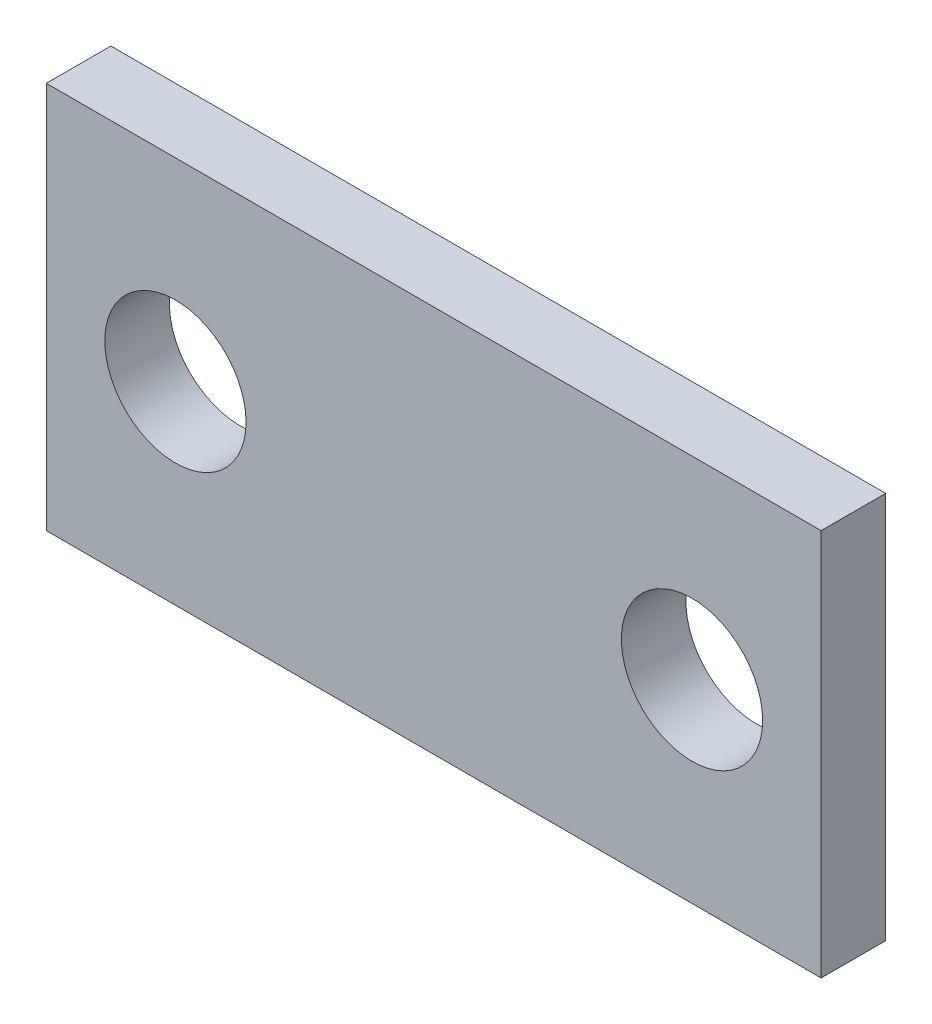
ISO-10303-21;
HEADER;
FILE_DESCRIPTION(('STEP AP214'),'2;1');
FILE_NAME('part.step','',(''),(''),'','','');
FILE_SCHEMA(('AUTOMOTIVE_DESIGN { 1 0 10303 214 1 1 1 1 }'));
ENDSEC;
DATA;
#1=APPLICATION_CONTEXT('core data for automotive mechanical design processes');
#2=APPLICATION_PROTOCOL_DEFINITION('international standard','automotive_design',2000,#1);
#3=PRODUCT_CONTEXT('',#1,'mechanical');
#4=PRODUCT('Part','Part','',(#3));
#5=PRODUCT_RELATED_PRODUCT_CATEGORY('part','',(#4));
#6=PRODUCT_DEFINITION_FORMATION('','',#4);
#7=PRODUCT_DEFINITION_CONTEXT('part definition',#1,'design');
#8=PRODUCT_DEFINITION('design','',#6,#7);
#9=PRODUCT_DEFINITION_SHAPE('','',#8);
#10=(LENGTH_UNIT() NAMED_UNIT(*) SI_UNIT(.MILLI.,.METRE.));
#11=(NAMED_UNIT(*) PLANE_ANGLE_UNIT() SI_UNIT($,.RADIAN.));
#12=(NAMED_UNIT(*) SI_UNIT($,.STERADIAN.) SOLID_ANGLE_UNIT());
#13=UNCERTAINTY_MEASURE_WITH_UNIT(LENGTH_MEASURE(1.E-05),#10,'distance_accuracy_value','');
#14=(GEOMETRIC_REPRESENTATION_CONTEXT(3) GLOBAL_UNCERTAINTY_ASSIGNED_CONTEXT((#13)) GLOBAL_UNIT_ASSIGNED_CONTEXT((#10,
#11,#12)) REPRESENTATION_CONTEXT('',''));
#15=CARTESIAN_POINT('',(0.,0.,0.));
#16=DIRECTION('',(0.,0.,1.));
#17=DIRECTION('',(1.,0.,0.));
#18=AXIS2_PLACEMENT_3D('',#15,#16,#17);
#19=CARTESIAN_POINT('',(38.1,-19.05,-6.35));
#20=DIRECTION('',(1.,0.,0.));
#21=DIRECTION('',(0.,0.,-1.));
#22=AXIS2_PLACEMENT_3D('',#19,#20,#21);
#23=PLANE('',#22);
#24=DIRECTION('',(0.,1.,0.));
#25=VECTOR('',#24,1.);
#26=CARTESIAN_POINT('',(38.1,-19.05,0.));
#27=LINE('',#26,#25);
#28=CARTESIAN_POINT('',(38.1,-19.05,0.));
#29=VERTEX_POINT('',#28);
#30=CARTESIAN_POINT('',(38.1,19.05,0.));
#31=VERTEX_POINT('',#30);
#32=EDGE_CURVE('E97',#29,#31,#27,.T.);
#33=ORIENTED_EDGE('',*,*,#32,.F.);
#34=DIRECTION('',(0.,0.,1.));
#35=VECTOR('',#34,1.);
#36=CARTESIAN_POINT('',(38.1,-19.05,-6.35));
#37=LINE('',#36,#35);
#38=CARTESIAN_POINT('',(38.1,-19.05,-6.35));
#39=VERTEX_POINT('',#38);
#40=EDGE_CURVE('E11',#39,#29,#37,.T.);
#41=ORIENTED_EDGE('',*,*,#40,.F.);
#42=DIRECTION('',(0.,1.,0.));
#43=VECTOR('',#42,1.);
#44=CARTESIAN_POINT('',(38.1,-19.05,-6.35));
#45=LINE('',#44,#43);
#46=CARTESIAN_POINT('',(38.1,19.05,-6.35));
#47=VERTEX_POINT('',#46);
#48=EDGE_CURVE('E90',#39,#47,#45,.T.);
#49=ORIENTED_EDGE('',*,*,#48,.T.);
#50=DIRECTION('',(0.,0.,1.));
#51=VECTOR('',#50,1.);
#52=CARTESIAN_POINT('',(38.1,19.05,-6.35));
#53=LINE('',#52,#51);
#54=EDGE_CURVE('E35',#47,#31,#53,.T.);
#55=ORIENTED_EDGE('',*,*,#54,.T.);
#56=EDGE_LOOP('',(#33,#41,#49,#55));
#57=FACE_BOUND('',#56,.T.);
#58=ADVANCED_FACE('F32',(#57),#23,.T.);
#59=CARTESIAN_POINT('',(-38.1,-19.05,-6.35));
#60=DIRECTION('',(0.,-1.,0.));
#61=DIRECTION('',(0.,0.,-1.));
#62=AXIS2_PLACEMENT_3D('',#59,#60,#61);
#63=PLANE('',#62);
#64=DIRECTION('',(1.,0.,0.));
#65=VECTOR('',#64,1.);
#66=CARTESIAN_POINT('',(-38.1,-19.05,0.));
#67=LINE('',#66,#65);
#68=CARTESIAN_POINT('',(-38.1,-19.05,0.));
#69=VERTEX_POINT('',#68);
#70=EDGE_CURVE('E92',#69,#29,#67,.T.);
#71=ORIENTED_EDGE('',*,*,#70,.F.);
#72=DIRECTION('',(0.,0.,1.));
#73=VECTOR('',#72,1.);
#74=CARTESIAN_POINT('',(-38.1,-19.05,-6.35));
#75=LINE('',#74,#73);
#76=CARTESIAN_POINT('',(-38.1,-19.05,-6.35));
#77=VERTEX_POINT('',#76);
#78=EDGE_CURVE('E41',#77,#69,#75,.T.);
#79=ORIENTED_EDGE('',*,*,#78,.F.);
#80=DIRECTION('',(1.,0.,0.));
#81=VECTOR('',#80,1.);
#82=CARTESIAN_POINT('',(-38.1,-19.05,-6.35));
#83=LINE('',#82,#81);
#84=EDGE_CURVE('E87',#77,#39,#83,.T.);
#85=ORIENTED_EDGE('',*,*,#84,.T.);
#86=ORIENTED_EDGE('',*,*,#40,.T.);
#87=EDGE_LOOP('',(#71,#79,#85,#86));
#88=FACE_BOUND('',#87,.T.);
#89=ADVANCED_FACE('F108',(#88),#63,.T.);
#90=CARTESIAN_POINT('',(-38.1,-19.05,-6.35));
#91=DIRECTION('',(-1.,0.,0.));
#92=DIRECTION('',(0.,0.,1.));
#93=AXIS2_PLACEMENT_3D('',#90,#91,#92);
#94=PLANE('',#93);
#95=DIRECTION('',(0.,-1.,0.));
#96=VECTOR('',#95,1.);
#97=CARTESIAN_POINT('',(-38.1,-19.05,0.));
#98=LINE('',#97,#96);
#99=CARTESIAN_POINT('',(-38.1,19.05,0.));
#100=VERTEX_POINT('',#99);
#101=EDGE_CURVE('E82',#100,#69,#98,.T.);
#102=ORIENTED_EDGE('',*,*,#101,.F.);
#103=DIRECTION('',(0.,0.,1.));
#104=VECTOR('',#103,1.);
#105=CARTESIAN_POINT('',(-38.1,19.05,-6.35));
#106=LINE('',#105,#104);
#107=CARTESIAN_POINT('',(-38.1,19.05,-6.35));
#108=VERTEX_POINT('',#107);
#109=EDGE_CURVE('E77',#108,#100,#106,.T.);
#110=ORIENTED_EDGE('',*,*,#109,.F.);
#111=DIRECTION('',(0.,-1.,0.));
#112=VECTOR('',#111,1.);
#113=CARTESIAN_POINT('',(-38.1,-19.05,-6.35));
#114=LINE('',#113,#112);
#115=EDGE_CURVE('E80',#108,#77,#114,.T.);
#116=ORIENTED_EDGE('',*,*,#115,.T.);
#117=ORIENTED_EDGE('',*,*,#78,.T.);
#118=EDGE_LOOP('',(#102,#110,#116,#117));
#119=FACE_BOUND('',#118,.T.);
#120=ADVANCED_FACE('F79',(#119),#94,.T.);
#121=CARTESIAN_POINT('',(-38.1,19.05,-6.35));
#122=DIRECTION('',(0.,1.,0.));
#123=DIRECTION('',(0.,0.,1.));
#124=AXIS2_PLACEMENT_3D('',#121,#122,#123);
#125=PLANE('',#124);
#126=DIRECTION('',(-1.,0.,0.));
#127=VECTOR('',#126,1.);
#128=CARTESIAN_POINT('',(-38.1,19.05,0.));
#129=LINE('',#128,#127);
#130=EDGE_CURVE('E100',#31,#100,#129,.T.);
#131=ORIENTED_EDGE('',*,*,#130,.F.);
#132=ORIENTED_EDGE('',*,*,#54,.F.);
#133=DIRECTION('',(-1.,0.,0.));
#134=VECTOR('',#133,1.);
#135=CARTESIAN_POINT('',(-38.1,19.05,-6.35));
#136=LINE('',#135,#134);
#137=EDGE_CURVE('E86',#47,#108,#136,.T.);
#138=ORIENTED_EDGE('',*,*,#137,.T.);
#139=ORIENTED_EDGE('',*,*,#109,.T.);
#140=EDGE_LOOP('',(#131,#132,#138,#139));
#141=FACE_BOUND('',#140,.T.);
#142=ADVANCED_FACE('F89',(#141),#125,.T.);
#143=CARTESIAN_POINT('',(38.1,19.05,-6.35));
#144=DIRECTION('',(0.,0.,-1.));
#145=DIRECTION('',(-1.,0.,0.));
#146=AXIS2_PLACEMENT_3D('',#143,#144,#145);
#147=PLANE('',#146);
#148=CARTESIAN_POINT('',(-25.4,0.,-6.34999999999999));
#149=DIRECTION('',(0.,0.,1.));
#150=DIRECTION('',(1.,0.,0.));
#151=AXIS2_PLACEMENT_3D('',#148,#149,#150);
#152=CIRCLE('',#151,6.94562999999999);
#153=CARTESIAN_POINT('',(-18.45437,0.,-6.34999999999999));
#154=VERTEX_POINT('',#153);
#155=EDGE_CURVE('E141',#154,#154,#152,.T.);
#156=ORIENTED_EDGE('',*,*,#155,.T.);
#157=EDGE_LOOP('',(#156));
#158=FACE_BOUND('',#157,.T.);
#159=CARTESIAN_POINT('',(25.4,0.,-6.34999999999999));
#160=DIRECTION('',(0.,0.,1.));
#161=DIRECTION('',(1.,0.,0.));
#162=AXIS2_PLACEMENT_3D('',#159,#160,#161);
#163=CIRCLE('',#162,6.94562999999999);
#164=CARTESIAN_POINT('',(32.34563,0.,-6.34999999999999));
#165=VERTEX_POINT('',#164);
#166=EDGE_CURVE('E101',#165,#165,#163,.T.);
#167=ORIENTED_EDGE('',*,*,#166,.T.);
#168=EDGE_LOOP('',(#167));
#169=FACE_BOUND('',#168,.T.);
#170=ORIENTED_EDGE('',*,*,#48,.F.);
#171=ORIENTED_EDGE('',*,*,#84,.F.);
#172=ORIENTED_EDGE('',*,*,#115,.F.);
#173=ORIENTED_EDGE('',*,*,#137,.F.);
#174=EDGE_LOOP('',(#170,#171,#172,#173));
#175=FACE_BOUND('',#174,.T.);
#176=ADVANCED_FACE('F85',(#158,#169,#175),#147,.T.);
#177=CARTESIAN_POINT('',(38.1,19.05,0.));
#178=DIRECTION('',(0.,0.,-1.));
#179=DIRECTION('',(-1.,0.,0.));
#180=AXIS2_PLACEMENT_3D('',#177,#178,#179);
#181=PLANE('',#180);
#182=CARTESIAN_POINT('',(-25.4,0.,0.));
#183=DIRECTION('',(0.,0.,1.));
#184=DIRECTION('',(1.,0.,0.));
#185=AXIS2_PLACEMENT_3D('',#182,#183,#184);
#186=CIRCLE('',#185,6.94562999999999);
#187=CARTESIAN_POINT('',(-18.45437,0.,0.));
#188=VERTEX_POINT('',#187);
#189=EDGE_CURVE('E144',#188,#188,#186,.T.);
#190=ORIENTED_EDGE('',*,*,#189,.F.);
#191=EDGE_LOOP('',(#190));
#192=FACE_BOUND('',#191,.T.);
#193=CARTESIAN_POINT('',(25.4,0.,0.));
#194=DIRECTION('',(0.,0.,1.));
#195=DIRECTION('',(1.,0.,0.));
#196=AXIS2_PLACEMENT_3D('',#193,#194,#195);
#197=CIRCLE('',#196,6.94562999999999);
#198=CARTESIAN_POINT('',(32.34563,0.,0.));
#199=VERTEX_POINT('',#198);
#200=EDGE_CURVE('E146',#199,#199,#197,.T.);
#201=ORIENTED_EDGE('',*,*,#200,.F.);
#202=EDGE_LOOP('',(#201));
#203=FACE_BOUND('',#202,.T.);
#204=ORIENTED_EDGE('',*,*,#32,.T.);
#205=ORIENTED_EDGE('',*,*,#130,.T.);
#206=ORIENTED_EDGE('',*,*,#101,.T.);
#207=ORIENTED_EDGE('',*,*,#70,.T.);
#208=EDGE_LOOP('',(#204,#205,#206,#207));
#209=FACE_BOUND('',#208,.T.);
#210=ADVANCED_FACE('F107',(#192,#203,#209),#181,.F.);
#211=CARTESIAN_POINT('',(25.4,0.,0.));
#212=DIRECTION('',(0.,0.,1.));
#213=DIRECTION('',(1.,0.,0.));
#214=AXIS2_PLACEMENT_3D('',#211,#212,#213);
#215=CYLINDRICAL_SURFACE('',#214,6.94562999999999);
#216=ORIENTED_EDGE('',*,*,#166,.F.);
#217=EDGE_LOOP('',(#216));
#218=FACE_BOUND('',#217,.T.);
#219=ORIENTED_EDGE('',*,*,#200,.T.);
#220=EDGE_LOOP('',(#219));
#221=FACE_BOUND('',#220,.T.);
#222=ADVANCED_FACE('F126',(#218,#221),#215,.F.);
#223=CARTESIAN_POINT('',(-25.4,0.,0.));
#224=DIRECTION('',(0.,0.,1.));
#225=DIRECTION('',(1.,0.,0.));
#226=AXIS2_PLACEMENT_3D('',#223,#224,#225);
#227=CYLINDRICAL_SURFACE('',#226,6.94562999999999);
#228=ORIENTED_EDGE('',*,*,#155,.F.);
#229=EDGE_LOOP('',(#228));
#230=FACE_BOUND('',#229,.T.);
#231=ORIENTED_EDGE('',*,*,#189,.T.);
#232=EDGE_LOOP('',(#231));
#233=FACE_BOUND('',#232,.T.);
#234=ADVANCED_FACE('F133',(#230,#233),#227,.F.);
#235=CLOSED_SHELL('',(#58,#89,#120,#142,#176,#210,#222,#234));
#236=MANIFOLD_SOLID_BREP('B2',#235);
#237=ADVANCED_BREP_SHAPE_REPRESENTATION('',(#18,#236),#14);
#238=SHAPE_DEFINITION_REPRESENTATION(#9,#237);
ENDSEC;
END-ISO-10303-21;
